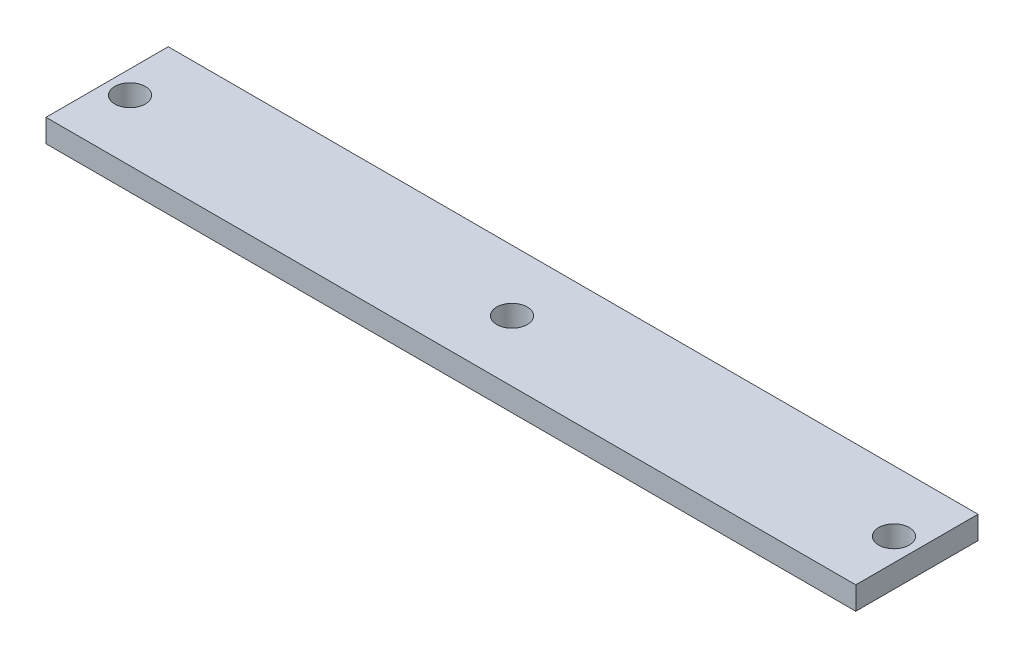
ISO-10303-21;
HEADER;
FILE_DESCRIPTION(('STEP AP214'),'2;1');
FILE_NAME('part.step','',(''),(''),'','','');
FILE_SCHEMA(('AUTOMOTIVE_DESIGN { 1 0 10303 214 1 1 1 1 }'));
ENDSEC;
DATA;
#1=APPLICATION_CONTEXT('core data for automotive mechanical design processes');
#2=APPLICATION_PROTOCOL_DEFINITION('international standard','automotive_design',2000,#1);
#3=PRODUCT_CONTEXT('',#1,'mechanical');
#4=PRODUCT('Part','Part','',(#3));
#5=PRODUCT_RELATED_PRODUCT_CATEGORY('part','',(#4));
#6=PRODUCT_DEFINITION_FORMATION('','',#4);
#7=PRODUCT_DEFINITION_CONTEXT('part definition',#1,'design');
#8=PRODUCT_DEFINITION('design','',#6,#7);
#9=PRODUCT_DEFINITION_SHAPE('','',#8);
#10=(LENGTH_UNIT() NAMED_UNIT(*) SI_UNIT(.MILLI.,.METRE.));
#11=(NAMED_UNIT(*) PLANE_ANGLE_UNIT() SI_UNIT($,.RADIAN.));
#12=(NAMED_UNIT(*) SI_UNIT($,.STERADIAN.) SOLID_ANGLE_UNIT());
#13=UNCERTAINTY_MEASURE_WITH_UNIT(LENGTH_MEASURE(1.E-05),#10,'distance_accuracy_value','');
#14=(GEOMETRIC_REPRESENTATION_CONTEXT(3) GLOBAL_UNCERTAINTY_ASSIGNED_CONTEXT((#13)) GLOBAL_UNIT_ASSIGNED_CONTEXT((#10,
#11,#12)) REPRESENTATION_CONTEXT('',''));
#15=CARTESIAN_POINT('',(0.,0.,0.));
#16=DIRECTION('',(0.,0.,1.));
#17=DIRECTION('',(1.,0.,0.));
#18=AXIS2_PLACEMENT_3D('',#15,#16,#17);
#19=CARTESIAN_POINT('',(53.,1.5,8.));
#20=DIRECTION('',(-1.,0.,0.));
#21=DIRECTION('',(0.,0.,1.));
#22=AXIS2_PLACEMENT_3D('',#19,#20,#21);
#23=PLANE('',#22);
#24=DIRECTION('',(0.,0.,-1.));
#25=VECTOR('',#24,1.);
#26=CARTESIAN_POINT('',(53.,-1.5,8.));
#27=LINE('',#26,#25);
#28=CARTESIAN_POINT('',(53.,-1.5,8.));
#29=VERTEX_POINT('',#28);
#30=CARTESIAN_POINT('',(53.,-1.5,-8.));
#31=VERTEX_POINT('',#30);
#32=EDGE_CURVE('E97',#29,#31,#27,.T.);
#33=ORIENTED_EDGE('',*,*,#32,.T.);
#34=DIRECTION('',(0.,-1.,0.));
#35=VECTOR('',#34,1.);
#36=CARTESIAN_POINT('',(53.,1.5,-8.));
#37=LINE('',#36,#35);
#38=CARTESIAN_POINT('',(53.,1.5,-8.));
#39=VERTEX_POINT('',#38);
#40=EDGE_CURVE('E11',#39,#31,#37,.T.);
#41=ORIENTED_EDGE('',*,*,#40,.F.);
#42=DIRECTION('',(0.,0.,-1.));
#43=VECTOR('',#42,1.);
#44=CARTESIAN_POINT('',(53.,1.5,8.));
#45=LINE('',#44,#43);
#46=CARTESIAN_POINT('',(53.,1.5,8.));
#47=VERTEX_POINT('',#46);
#48=EDGE_CURVE('E85',#47,#39,#45,.T.);
#49=ORIENTED_EDGE('',*,*,#48,.F.);
#50=DIRECTION('',(0.,-1.,0.));
#51=VECTOR('',#50,1.);
#52=CARTESIAN_POINT('',(53.,1.5,8.));
#53=LINE('',#52,#51);
#54=EDGE_CURVE('E93',#47,#29,#53,.T.);
#55=ORIENTED_EDGE('',*,*,#54,.T.);
#56=EDGE_LOOP('',(#33,#41,#49,#55));
#57=FACE_BOUND('',#56,.T.);
#58=ADVANCED_FACE('F34',(#57),#23,.F.);
#59=CARTESIAN_POINT('',(-53.,1.5,-8.));
#60=DIRECTION('',(0.,0.,1.));
#61=DIRECTION('',(1.,0.,0.));
#62=AXIS2_PLACEMENT_3D('',#59,#60,#61);
#63=PLANE('',#62);
#64=DIRECTION('',(-1.,0.,0.));
#65=VECTOR('',#64,1.);
#66=CARTESIAN_POINT('',(-53.,-1.5,-8.));
#67=LINE('',#66,#65);
#68=CARTESIAN_POINT('',(-53.,-1.5,-8.));
#69=VERTEX_POINT('',#68);
#70=EDGE_CURVE('E89',#31,#69,#67,.T.);
#71=ORIENTED_EDGE('',*,*,#70,.T.);
#72=DIRECTION('',(0.,-1.,0.));
#73=VECTOR('',#72,1.);
#74=CARTESIAN_POINT('',(-53.,1.5,-8.));
#75=LINE('',#74,#73);
#76=CARTESIAN_POINT('',(-53.,1.5,-8.));
#77=VERTEX_POINT('',#76);
#78=EDGE_CURVE('E42',#77,#69,#75,.T.);
#79=ORIENTED_EDGE('',*,*,#78,.F.);
#80=DIRECTION('',(-1.,0.,0.));
#81=VECTOR('',#80,1.);
#82=CARTESIAN_POINT('',(-53.,1.5,-8.));
#83=LINE('',#82,#81);
#84=EDGE_CURVE('E80',#39,#77,#83,.T.);
#85=ORIENTED_EDGE('',*,*,#84,.F.);
#86=ORIENTED_EDGE('',*,*,#40,.T.);
#87=EDGE_LOOP('',(#71,#79,#85,#86));
#88=FACE_BOUND('',#87,.T.);
#89=ADVANCED_FACE('F88',(#88),#63,.F.);
#90=CARTESIAN_POINT('',(-53.,1.5,8.));
#91=DIRECTION('',(1.,0.,0.));
#92=DIRECTION('',(0.,0.,-1.));
#93=AXIS2_PLACEMENT_3D('',#90,#91,#92);
#94=PLANE('',#93);
#95=DIRECTION('',(0.,0.,1.));
#96=VECTOR('',#95,1.);
#97=CARTESIAN_POINT('',(-53.,-1.5,8.));
#98=LINE('',#97,#96);
#99=CARTESIAN_POINT('',(-53.,-1.5,8.));
#100=VERTEX_POINT('',#99);
#101=EDGE_CURVE('E67',#69,#100,#98,.T.);
#102=ORIENTED_EDGE('',*,*,#101,.T.);
#103=DIRECTION('',(0.,-1.,0.));
#104=VECTOR('',#103,1.);
#105=CARTESIAN_POINT('',(-53.,1.5,8.));
#106=LINE('',#105,#104);
#107=CARTESIAN_POINT('',(-53.,1.5,8.));
#108=VERTEX_POINT('',#107);
#109=EDGE_CURVE('E90',#108,#100,#106,.T.);
#110=ORIENTED_EDGE('',*,*,#109,.F.);
#111=DIRECTION('',(0.,0.,1.));
#112=VECTOR('',#111,1.);
#113=CARTESIAN_POINT('',(-53.,1.5,8.));
#114=LINE('',#113,#112);
#115=EDGE_CURVE('E83',#77,#108,#114,.T.);
#116=ORIENTED_EDGE('',*,*,#115,.F.);
#117=ORIENTED_EDGE('',*,*,#78,.T.);
#118=EDGE_LOOP('',(#102,#110,#116,#117));
#119=FACE_BOUND('',#118,.T.);
#120=ADVANCED_FACE('F91',(#119),#94,.F.);
#121=CARTESIAN_POINT('',(-53.,1.5,8.));
#122=DIRECTION('',(0.,0.,-1.));
#123=DIRECTION('',(-1.,0.,0.));
#124=AXIS2_PLACEMENT_3D('',#121,#122,#123);
#125=PLANE('',#124);
#126=DIRECTION('',(1.,0.,0.));
#127=VECTOR('',#126,1.);
#128=CARTESIAN_POINT('',(-53.,-1.5,8.));
#129=LINE('',#128,#127);
#130=EDGE_CURVE('E73',#100,#29,#129,.T.);
#131=ORIENTED_EDGE('',*,*,#130,.T.);
#132=ORIENTED_EDGE('',*,*,#54,.F.);
#133=DIRECTION('',(1.,0.,0.));
#134=VECTOR('',#133,1.);
#135=CARTESIAN_POINT('',(-53.,1.5,8.));
#136=LINE('',#135,#134);
#137=EDGE_CURVE('E50',#108,#47,#136,.T.);
#138=ORIENTED_EDGE('',*,*,#137,.F.);
#139=ORIENTED_EDGE('',*,*,#109,.T.);
#140=EDGE_LOOP('',(#131,#132,#138,#139));
#141=FACE_BOUND('',#140,.T.);
#142=ADVANCED_FACE('F105',(#141),#125,.F.);
#143=CARTESIAN_POINT('',(0.,1.5,0.));
#144=DIRECTION('',(0.,-1.,0.));
#145=DIRECTION('',(0.,0.,-1.));
#146=AXIS2_PLACEMENT_3D('',#143,#144,#145);
#147=PLANE('',#146);
#148=CARTESIAN_POINT('',(-50.,1.5,0.));
#149=DIRECTION('',(0.,-1.,0.));
#150=DIRECTION('',(0.,0.,-1.));
#151=AXIS2_PLACEMENT_3D('',#148,#149,#150);
#152=CIRCLE('',#151,2.);
#153=CARTESIAN_POINT('',(-50.,1.5,-2.00000000000002));
#154=VERTEX_POINT('',#153);
#155=EDGE_CURVE('E123',#154,#154,#152,.T.);
#156=ORIENTED_EDGE('',*,*,#155,.T.);
#157=EDGE_LOOP('',(#156));
#158=FACE_BOUND('',#157,.T.);
#159=CARTESIAN_POINT('',(0.,1.5,0.));
#160=DIRECTION('',(0.,-1.,0.));
#161=DIRECTION('',(0.,0.,-1.));
#162=AXIS2_PLACEMENT_3D('',#159,#160,#161);
#163=CIRCLE('',#162,2.);
#164=CARTESIAN_POINT('',(0.,1.5,-1.99999999999999));
#165=VERTEX_POINT('',#164);
#166=EDGE_CURVE('E120',#165,#165,#163,.T.);
#167=ORIENTED_EDGE('',*,*,#166,.T.);
#168=EDGE_LOOP('',(#167));
#169=FACE_BOUND('',#168,.T.);
#170=CARTESIAN_POINT('',(50.,1.5,0.));
#171=DIRECTION('',(0.,-1.,0.));
#172=DIRECTION('',(0.,0.,-1.));
#173=AXIS2_PLACEMENT_3D('',#170,#171,#172);
#174=CIRCLE('',#173,2.);
#175=CARTESIAN_POINT('',(50.,1.5,-2.00000000000001));
#176=VERTEX_POINT('',#175);
#177=EDGE_CURVE('E114',#176,#176,#174,.T.);
#178=ORIENTED_EDGE('',*,*,#177,.T.);
#179=EDGE_LOOP('',(#178));
#180=FACE_BOUND('',#179,.T.);
#181=ORIENTED_EDGE('',*,*,#48,.T.);
#182=ORIENTED_EDGE('',*,*,#84,.T.);
#183=ORIENTED_EDGE('',*,*,#115,.T.);
#184=ORIENTED_EDGE('',*,*,#137,.T.);
#185=EDGE_LOOP('',(#181,#182,#183,#184));
#186=FACE_BOUND('',#185,.T.);
#187=ADVANCED_FACE('F81',(#158,#169,#180,#186),#147,.F.);
#188=CARTESIAN_POINT('',(0.,-1.5,0.));
#189=DIRECTION('',(0.,-1.,0.));
#190=DIRECTION('',(0.,0.,-1.));
#191=AXIS2_PLACEMENT_3D('',#188,#189,#190);
#192=PLANE('',#191);
#193=CARTESIAN_POINT('',(-50.,-1.5,0.));
#194=DIRECTION('',(0.,-1.,0.));
#195=DIRECTION('',(0.,0.,-1.));
#196=AXIS2_PLACEMENT_3D('',#193,#194,#195);
#197=CIRCLE('',#196,2.);
#198=CARTESIAN_POINT('',(-50.,-1.5,-2.00000000000002));
#199=VERTEX_POINT('',#198);
#200=EDGE_CURVE('E100',#199,#199,#197,.T.);
#201=ORIENTED_EDGE('',*,*,#200,.F.);
#202=EDGE_LOOP('',(#201));
#203=FACE_BOUND('',#202,.T.);
#204=CARTESIAN_POINT('',(0.,-1.5,0.));
#205=DIRECTION('',(0.,-1.,0.));
#206=DIRECTION('',(0.,0.,-1.));
#207=AXIS2_PLACEMENT_3D('',#204,#205,#206);
#208=CIRCLE('',#207,2.);
#209=CARTESIAN_POINT('',(0.,-1.5,-1.99999999999999));
#210=VERTEX_POINT('',#209);
#211=EDGE_CURVE('E117',#210,#210,#208,.T.);
#212=ORIENTED_EDGE('',*,*,#211,.F.);
#213=EDGE_LOOP('',(#212));
#214=FACE_BOUND('',#213,.T.);
#215=CARTESIAN_POINT('',(50.,-1.5,0.));
#216=DIRECTION('',(0.,-1.,0.));
#217=DIRECTION('',(0.,0.,-1.));
#218=AXIS2_PLACEMENT_3D('',#215,#216,#217);
#219=CIRCLE('',#218,2.);
#220=CARTESIAN_POINT('',(50.,-1.5,-2.00000000000001));
#221=VERTEX_POINT('',#220);
#222=EDGE_CURVE('E111',#221,#221,#219,.T.);
#223=ORIENTED_EDGE('',*,*,#222,.F.);
#224=EDGE_LOOP('',(#223));
#225=FACE_BOUND('',#224,.T.);
#226=ORIENTED_EDGE('',*,*,#32,.F.);
#227=ORIENTED_EDGE('',*,*,#130,.F.);
#228=ORIENTED_EDGE('',*,*,#101,.F.);
#229=ORIENTED_EDGE('',*,*,#70,.F.);
#230=EDGE_LOOP('',(#226,#227,#228,#229));
#231=FACE_BOUND('',#230,.T.);
#232=ADVANCED_FACE('F108',(#203,#214,#225,#231),#192,.T.);
#233=CARTESIAN_POINT('',(50.,-1.5,0.));
#234=DIRECTION('',(0.,1.,0.));
#235=DIRECTION('',(0.,0.,1.));
#236=AXIS2_PLACEMENT_3D('',#233,#234,#235);
#237=CYLINDRICAL_SURFACE('',#236,2.);
#238=ORIENTED_EDGE('',*,*,#222,.T.);
#239=EDGE_LOOP('',(#238));
#240=FACE_BOUND('',#239,.T.);
#241=ORIENTED_EDGE('',*,*,#177,.F.);
#242=EDGE_LOOP('',(#241));
#243=FACE_BOUND('',#242,.T.);
#244=ADVANCED_FACE('F134',(#240,#243),#237,.F.);
#245=CARTESIAN_POINT('',(0.,-1.5,0.));
#246=DIRECTION('',(0.,1.,0.));
#247=DIRECTION('',(0.,0.,1.));
#248=AXIS2_PLACEMENT_3D('',#245,#246,#247);
#249=CYLINDRICAL_SURFACE('',#248,2.);
#250=ORIENTED_EDGE('',*,*,#211,.T.);
#251=EDGE_LOOP('',(#250));
#252=FACE_BOUND('',#251,.T.);
#253=ORIENTED_EDGE('',*,*,#166,.F.);
#254=EDGE_LOOP('',(#253));
#255=FACE_BOUND('',#254,.T.);
#256=ADVANCED_FACE('F142',(#252,#255),#249,.F.);
#257=CARTESIAN_POINT('',(-50.,-1.5,0.));
#258=DIRECTION('',(0.,1.,0.));
#259=DIRECTION('',(0.,0.,1.));
#260=AXIS2_PLACEMENT_3D('',#257,#258,#259);
#261=CYLINDRICAL_SURFACE('',#260,2.);
#262=ORIENTED_EDGE('',*,*,#200,.T.);
#263=EDGE_LOOP('',(#262));
#264=FACE_BOUND('',#263,.T.);
#265=ORIENTED_EDGE('',*,*,#155,.F.);
#266=EDGE_LOOP('',(#265));
#267=FACE_BOUND('',#266,.T.);
#268=ADVANCED_FACE('F129',(#264,#267),#261,.F.);
#269=CLOSED_SHELL('',(#58,#89,#120,#142,#187,#232,#244,#256,#268));
#270=MANIFOLD_SOLID_BREP('B2',#269);
#271=ADVANCED_BREP_SHAPE_REPRESENTATION('',(#18,#270),#14);
#272=SHAPE_DEFINITION_REPRESENTATION(#9,#271);
ENDSEC;
END-ISO-10303-21;
